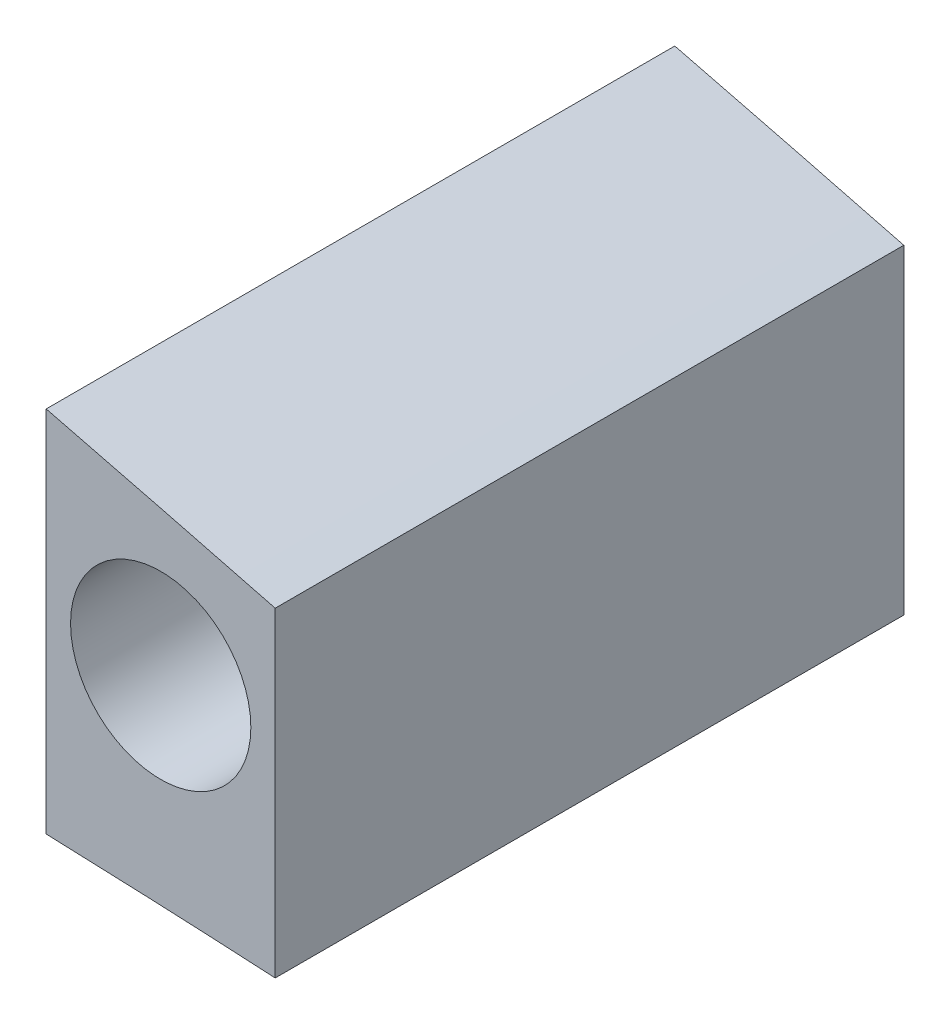
ISO-10303-21;
HEADER;
FILE_DESCRIPTION(('STEP AP214'),'2;1');
FILE_NAME('part.step','',(''),(''),'','','');
FILE_SCHEMA(('AUTOMOTIVE_DESIGN { 1 0 10303 214 1 1 1 1 }'));
ENDSEC;
DATA;
#1=APPLICATION_CONTEXT('core data for automotive mechanical design processes');
#2=APPLICATION_PROTOCOL_DEFINITION('international standard','automotive_design',2000,#1);
#3=PRODUCT_CONTEXT('',#1,'mechanical');
#4=PRODUCT('Part','Part','',(#3));
#5=PRODUCT_RELATED_PRODUCT_CATEGORY('part','',(#4));
#6=PRODUCT_DEFINITION_FORMATION('','',#4);
#7=PRODUCT_DEFINITION_CONTEXT('part definition',#1,'design');
#8=PRODUCT_DEFINITION('design','',#6,#7);
#9=PRODUCT_DEFINITION_SHAPE('','',#8);
#10=(LENGTH_UNIT() NAMED_UNIT(*) SI_UNIT(.MILLI.,.METRE.));
#11=(NAMED_UNIT(*) PLANE_ANGLE_UNIT() SI_UNIT($,.RADIAN.));
#12=(NAMED_UNIT(*) SI_UNIT($,.STERADIAN.) SOLID_ANGLE_UNIT());
#13=UNCERTAINTY_MEASURE_WITH_UNIT(LENGTH_MEASURE(1.E-05),#10,'distance_accuracy_value','');
#14=(GEOMETRIC_REPRESENTATION_CONTEXT(3) GLOBAL_UNCERTAINTY_ASSIGNED_CONTEXT((#13)) GLOBAL_UNIT_ASSIGNED_CONTEXT((#10,
#11,#12)) REPRESENTATION_CONTEXT('',''));
#15=CARTESIAN_POINT('',(0.,0.,0.));
#16=DIRECTION('',(0.,0.,1.));
#17=DIRECTION('',(1.,0.,0.));
#18=AXIS2_PLACEMENT_3D('',#15,#16,#17);
#19=CARTESIAN_POINT('',(0.000560351162113587,0.000130087070423624,34.8615));
#20=CARTESIAN_POINT('',(1.23071418869678,-6.92407609127206,34.8615));
#21=CARTESIAN_POINT('',(15.3166033306834,-6.18906584099094,34.8615));
#22=CARTESIAN_POINT('',(36.4546728163185,-6.09849990105009,34.8615));
#23=CARTESIAN_POINT('',(66.5061971849192,-0.586669106973501,34.8615));
#24=CARTESIAN_POINT('',(110.497331171581,6.18149522271792,34.8615));
#25=CARTESIAN_POINT('',(157.718638091679,9.03065014873911,34.8615));
#26=CARTESIAN_POINT('',(205.10142463584,8.83808028186313,34.8615));
#27=CARTESIAN_POINT('',(235.858814759408,7.87030619247826,34.8615));
#28=CARTESIAN_POINT('',(260.846344817159,5.42741339404395,34.8615));
#29=CARTESIAN_POINT('',(276.264022989737,4.51435670375389,34.8615));
#30=CARTESIAN_POINT('',(293.989507544058,2.09398731346533,34.8615));
#31=CARTESIAN_POINT('',(303.956832564589,1.47095520994628,34.8615));
#32=CARTESIAN_POINT('',(309.846313894505,0.000130087070423666,34.8615));
#33=B_SPLINE_CURVE_WITH_KNOTS('',3,(#19,#20,#21,#22,#23,#24,#25,#26,#27,#28,#29,#30,#31,#32),
.UNSPECIFIED.,.F.,.F.,(4,1,1,1,1,1,1,1,1,1,1,4),(0.,0.0569078595717698,0.106482711504673,
0.214488052979465,0.341297688349143,0.535095665520157,0.664680853556909,0.794660698192775,
0.828978881532905,0.904725108725214,0.942212919019968,1.),.UNSPECIFIED.);
#34=DIRECTION('',(0.,0.,-1.));
#35=VECTOR('',#34,1.);
#36=SURFACE_OF_LINEAR_EXTRUSION('',#33,#35);
#37=CARTESIAN_POINT('',(220.946313894505,8.25519881438191,34.8615));
#38=VERTEX_POINT('',#37);
#39=CARTESIAN_POINT('',(233.646313894505,7.69052977146896,34.8615));
#40=VERTEX_POINT('',#39);
#41=EDGE_CURVE('E86',#38,#40,#33,.T.);
#42=ORIENTED_EDGE('',*,*,#41,.F.);
#43=DIRECTION('',(0.,0.,-1.));
#44=VECTOR('',#43,1.);
#45=CARTESIAN_POINT('',(220.946313894505,8.25519881439545,34.8615));
#46=LINE('',#45,#44);
#47=CARTESIAN_POINT('',(220.946313894505,8.25519881438191,0.));
#48=VERTEX_POINT('',#47);
#49=EDGE_CURVE('E74',#38,#48,#46,.T.);
#50=ORIENTED_EDGE('',*,*,#49,.T.);
#51=CARTESIAN_POINT('',(0.000560351162113587,0.000130087070423624,0.));
#52=CARTESIAN_POINT('',(1.23071418869678,-6.92407609127206,0.));
#53=CARTESIAN_POINT('',(15.3166033306834,-6.18906584099094,0.));
#54=CARTESIAN_POINT('',(36.4546728163185,-6.09849990105009,0.));
#55=CARTESIAN_POINT('',(66.5061971849192,-0.586669106973501,0.));
#56=CARTESIAN_POINT('',(110.497331171581,6.18149522271792,0.));
#57=CARTESIAN_POINT('',(157.718638091679,9.03065014873911,0.));
#58=CARTESIAN_POINT('',(205.10142463584,8.83808028186313,0.));
#59=CARTESIAN_POINT('',(235.858814759408,7.87030619247826,0.));
#60=CARTESIAN_POINT('',(260.846344817159,5.42741339404395,0.));
#61=CARTESIAN_POINT('',(276.264022989737,4.51435670375389,0.));
#62=CARTESIAN_POINT('',(293.989507544058,2.09398731346533,0.));
#63=CARTESIAN_POINT('',(303.956832564589,1.47095520994628,0.));
#64=CARTESIAN_POINT('',(309.846313894505,0.000130087070423666,0.));
#65=B_SPLINE_CURVE_WITH_KNOTS('',3,(#51,#52,#53,#54,#55,#56,#57,#58,#59,#60,#61,#62,#63,#64),
.UNSPECIFIED.,.F.,.F.,(4,1,1,1,1,1,1,1,1,1,1,4),(0.,0.0569078595717698,0.106482711504673,
0.214488052979465,0.341297688349143,0.535095665520157,0.664680853556909,0.794660698192775,
0.828978881532905,0.904725108725214,0.942212919019968,1.),.UNSPECIFIED.);
#66=CARTESIAN_POINT('',(233.646313884782,7.69052977146896,0.));
#67=VERTEX_POINT('',#66);
#68=EDGE_CURVE('E58',#48,#67,#65,.T.);
#69=ORIENTED_EDGE('',*,*,#68,.T.);
#70=DIRECTION('',(0.,0.,-1.));
#71=VECTOR('',#70,1.);
#72=CARTESIAN_POINT('',(233.646313894505,7.69052977092525,34.8615));
#73=LINE('',#72,#71);
#74=EDGE_CURVE('E90',#67,#40,#73,.F.);
#75=ORIENTED_EDGE('',*,*,#74,.T.);
#76=EDGE_LOOP('',(#42,#50,#69,#75));
#77=FACE_BOUND('',#76,.T.);
#78=ADVANCED_FACE('F35',(#77),#36,.F.);
#79=CARTESIAN_POINT('',(309.846313894505,0.000130087070423864,34.8615));
#80=CARTESIAN_POINT('',(314.816918223261,-0.51620674157964,34.8615));
#81=CARTESIAN_POINT('',(301.273197720551,4.38282813873556,34.8615));
#82=CARTESIAN_POINT('',(290.359837670022,8.71099439045776,34.8615));
#83=CARTESIAN_POINT('',(256.952064400645,19.5289209482833,34.8615));
#84=CARTESIAN_POINT('',(217.961060472083,29.6129748944238,34.8615));
#85=CARTESIAN_POINT('',(173.256699242147,40.0411042779434,34.8615));
#86=CARTESIAN_POINT('',(131.400792108858,47.8848319151037,34.8615));
#87=CARTESIAN_POINT('',(89.5976184754884,49.290763053775,34.8615));
#88=CARTESIAN_POINT('',(52.1111282710831,42.0692152748914,34.8615));
#89=CARTESIAN_POINT('',(26.2867198183782,29.9751763284633,34.8615));
#90=CARTESIAN_POINT('',(8.64909202481883,17.8566051741579,34.8615));
#91=CARTESIAN_POINT('',(0.810633126632263,7.35919605469637,34.8615));
#92=CARTESIAN_POINT('',(0.000560351162116727,0.000130087070423829,34.8615));
#93=B_SPLINE_CURVE_WITH_KNOTS('',3,(#79,#80,#81,#82,#83,#84,#85,#86,#87,#88,#89,#90,#91,#92),
.UNSPECIFIED.,.F.,.F.,(4,1,1,1,1,1,1,1,1,1,1,4),(0.,0.0239417713693992,0.070244030177139,
0.147561721425381,0.308455887006792,0.442387865106874,0.551517565626309,0.687091076796298,
0.811391258419108,0.886311735305172,0.939136382225768,1.),.UNSPECIFIED.);
#94=DIRECTION('',(0.,0.,-1.));
#95=VECTOR('',#94,1.);
#96=SURFACE_OF_LINEAR_EXTRUSION('',#93,#95);
#97=CARTESIAN_POINT('',(309.846313894505,0.000130087070423864,0.));
#98=CARTESIAN_POINT('',(314.816918223261,-0.51620674157964,0.));
#99=CARTESIAN_POINT('',(301.273197720551,4.38282813873556,0.));
#100=CARTESIAN_POINT('',(290.359837670022,8.71099439045776,0.));
#101=CARTESIAN_POINT('',(256.952064400645,19.5289209482833,0.));
#102=CARTESIAN_POINT('',(217.961060472083,29.6129748944238,0.));
#103=CARTESIAN_POINT('',(173.256699242147,40.0411042779434,0.));
#104=CARTESIAN_POINT('',(131.400792108858,47.8848319151037,0.));
#105=CARTESIAN_POINT('',(89.5976184754884,49.290763053775,0.));
#106=CARTESIAN_POINT('',(52.1111282710831,42.0692152748914,0.));
#107=CARTESIAN_POINT('',(26.2867198183782,29.9751763284633,0.));
#108=CARTESIAN_POINT('',(8.64909202481883,17.8566051741579,0.));
#109=CARTESIAN_POINT('',(0.810633126632263,7.35919605469637,0.));
#110=CARTESIAN_POINT('',(0.000560351162116727,0.000130087070423829,0.));
#111=B_SPLINE_CURVE_WITH_KNOTS('',3,(#97,#98,#99,#100,#101,#102,#103,#104,#105,#106,#107,#108,
#109,#110),.UNSPECIFIED.,.F.,.F.,(4,1,1,1,1,1,1,1,1,1,1,4),(0.,0.0239417713693992,
0.070244030177139,0.147561721425381,0.308455887006792,0.442387865106874,0.551517565626309,
0.687091076796298,0.811391258419108,0.886311735305172,0.939136382225768,1.),.UNSPECIFIED.);
#112=CARTESIAN_POINT('',(233.646313894505,25.4527523915985,0.));
#113=VERTEX_POINT('',#112);
#114=CARTESIAN_POINT('',(220.946313894505,28.6725157585963,0.));
#115=VERTEX_POINT('',#114);
#116=EDGE_CURVE('E91',#113,#115,#111,.T.);
#117=ORIENTED_EDGE('',*,*,#116,.T.);
#118=DIRECTION('',(0.,0.,-1.));
#119=VECTOR('',#118,1.);
#120=CARTESIAN_POINT('',(220.946313894505,28.6725157585964,34.8615));
#121=LINE('',#120,#119);
#122=CARTESIAN_POINT('',(220.946313894505,28.6725157585963,34.8615));
#123=VERTEX_POINT('',#122);
#124=EDGE_CURVE('E50',#115,#123,#121,.F.);
#125=ORIENTED_EDGE('',*,*,#124,.T.);
#126=CARTESIAN_POINT('',(233.646313894505,25.4527523915985,34.8615));
#127=VERTEX_POINT('',#126);
#128=EDGE_CURVE('E43',#127,#123,#93,.T.);
#129=ORIENTED_EDGE('',*,*,#128,.F.);
#130=DIRECTION('',(0.,0.,-1.));
#131=VECTOR('',#130,1.);
#132=CARTESIAN_POINT('',(233.646313894505,25.4527523940641,34.8615));
#133=LINE('',#132,#131);
#134=EDGE_CURVE('E182',#127,#113,#133,.T.);
#135=ORIENTED_EDGE('',*,*,#134,.T.);
#136=EDGE_LOOP('',(#117,#125,#129,#135));
#137=FACE_BOUND('',#136,.T.);
#138=ADVANCED_FACE('F111',(#137),#96,.F.);
#139=CARTESIAN_POINT('',(153.387816973495,8.33338198857885,34.8615));
#140=DIRECTION('',(0.,0.,-1.));
#141=DIRECTION('',(-1.,0.,0.));
#142=AXIS2_PLACEMENT_3D('',#139,#140,#141);
#143=PLANE('',#142);
#144=CARTESIAN_POINT('',(227.296313894505,19.0501300870704,34.8615));
#145=DIRECTION('',(0.,0.,1.));
#146=DIRECTION('',(1.,0.,0.));
#147=AXIS2_PLACEMENT_3D('',#144,#145,#146);
#148=CIRCLE('',#147,4.99999999999999);
#149=CARTESIAN_POINT('',(232.296313894505,19.0501300870704,34.8615));
#150=VERTEX_POINT('',#149);
#151=EDGE_CURVE('E180',#150,#150,#148,.T.);
#152=ORIENTED_EDGE('',*,*,#151,.F.);
#153=EDGE_LOOP('',(#152));
#154=FACE_BOUND('',#153,.T.);
#155=ORIENTED_EDGE('',*,*,#128,.T.);
#156=DIRECTION('',(0.,1.,0.));
#157=VECTOR('',#156,1.);
#158=CARTESIAN_POINT('',(220.946313894505,88.4656790063735,34.8615));
#159=LINE('',#158,#157);
#160=EDGE_CURVE('E77',#38,#123,#159,.T.);
#161=ORIENTED_EDGE('',*,*,#160,.F.);
#162=ORIENTED_EDGE('',*,*,#41,.T.);
#163=DIRECTION('',(0.,-1.,0.));
#164=VECTOR('',#163,1.);
#165=CARTESIAN_POINT('',(233.646313894505,-56.2829886042677,34.8615));
#166=LINE('',#165,#164);
#167=EDGE_CURVE('E80',#127,#40,#166,.T.);
#168=ORIENTED_EDGE('',*,*,#167,.F.);
#169=EDGE_LOOP('',(#155,#161,#162,#168));
#170=FACE_BOUND('',#169,.T.);
#171=ADVANCED_FACE('F84',(#154,#170),#143,.F.);
#172=CARTESIAN_POINT('',(153.387816973495,8.33338198857885,0.));
#173=DIRECTION('',(0.,0.,-1.));
#174=DIRECTION('',(-1.,0.,0.));
#175=AXIS2_PLACEMENT_3D('',#172,#173,#174);
#176=PLANE('',#175);
#177=DIRECTION('',(0.,1.,0.));
#178=VECTOR('',#177,1.);
#179=CARTESIAN_POINT('',(220.946313894505,88.4656790063735,0.));
#180=LINE('',#179,#178);
#181=EDGE_CURVE('E78',#48,#115,#180,.T.);
#182=ORIENTED_EDGE('',*,*,#181,.T.);
#183=ORIENTED_EDGE('',*,*,#116,.F.);
#184=DIRECTION('',(0.,1.,0.));
#185=VECTOR('',#184,1.);
#186=CARTESIAN_POINT('',(233.646313894505,8.33338198857885,0.));
#187=LINE('',#186,#185);
#188=EDGE_CURVE('E11',#67,#113,#187,.T.);
#189=ORIENTED_EDGE('',*,*,#188,.F.);
#190=ORIENTED_EDGE('',*,*,#68,.F.);
#191=EDGE_LOOP('',(#182,#183,#189,#190));
#192=FACE_BOUND('',#191,.T.);
#193=CARTESIAN_POINT('',(227.296313894505,19.0501300870704,0.));
#194=DIRECTION('',(0.,0.,1.));
#195=DIRECTION('',(1.,0.,0.));
#196=AXIS2_PLACEMENT_3D('',#193,#194,#195);
#197=CIRCLE('',#196,4.99999999999999);
#198=CARTESIAN_POINT('',(232.296313894505,19.0501300870704,0.));
#199=VERTEX_POINT('',#198);
#200=EDGE_CURVE('E177',#199,#199,#197,.T.);
#201=ORIENTED_EDGE('',*,*,#200,.T.);
#202=EDGE_LOOP('',(#201));
#203=FACE_BOUND('',#202,.T.);
#204=ADVANCED_FACE('F115',(#192,#203),#176,.T.);
#205=CARTESIAN_POINT('',(233.646313894505,-56.2829886042677,0.));
#206=DIRECTION('',(-1.,0.,0.));
#207=DIRECTION('',(0.,0.,1.));
#208=AXIS2_PLACEMENT_3D('',#205,#206,#207);
#209=PLANE('',#208);
#210=ORIENTED_EDGE('',*,*,#188,.T.);
#211=ORIENTED_EDGE('',*,*,#134,.F.);
#212=ORIENTED_EDGE('',*,*,#167,.T.);
#213=ORIENTED_EDGE('',*,*,#74,.F.);
#214=EDGE_LOOP('',(#210,#211,#212,#213));
#215=FACE_BOUND('',#214,.T.);
#216=ADVANCED_FACE('F118',(#215),#209,.F.);
#217=CARTESIAN_POINT('',(227.296313894505,19.0501300870704,0.));
#218=DIRECTION('',(0.,0.,1.));
#219=DIRECTION('',(1.,0.,0.));
#220=AXIS2_PLACEMENT_3D('',#217,#218,#219);
#221=CYLINDRICAL_SURFACE('',#220,4.99999999999999);
#222=ORIENTED_EDGE('',*,*,#200,.F.);
#223=EDGE_LOOP('',(#222));
#224=FACE_BOUND('',#223,.T.);
#225=ORIENTED_EDGE('',*,*,#151,.T.);
#226=EDGE_LOOP('',(#225));
#227=FACE_BOUND('',#226,.T.);
#228=ADVANCED_FACE('F125',(#224,#227),#221,.F.);
#229=CARTESIAN_POINT('',(220.946313894505,88.4656790063735,0.));
#230=DIRECTION('',(1.,0.,0.));
#231=DIRECTION('',(0.,0.,-1.));
#232=AXIS2_PLACEMENT_3D('',#229,#230,#231);
#233=PLANE('',#232);
#234=ORIENTED_EDGE('',*,*,#160,.T.);
#235=ORIENTED_EDGE('',*,*,#124,.F.);
#236=ORIENTED_EDGE('',*,*,#181,.F.);
#237=ORIENTED_EDGE('',*,*,#49,.F.);
#238=EDGE_LOOP('',(#234,#235,#236,#237));
#239=FACE_BOUND('',#238,.T.);
#240=ADVANCED_FACE('F76',(#239),#233,.F.);
#241=CLOSED_SHELL('',(#78,#138,#171,#204,#216,#228,#240));
#242=MANIFOLD_SOLID_BREP('B2',#241);
#243=ADVANCED_BREP_SHAPE_REPRESENTATION('',(#18,#242),#14);
#244=SHAPE_DEFINITION_REPRESENTATION(#9,#243);
ENDSEC;
END-ISO-10303-21;
